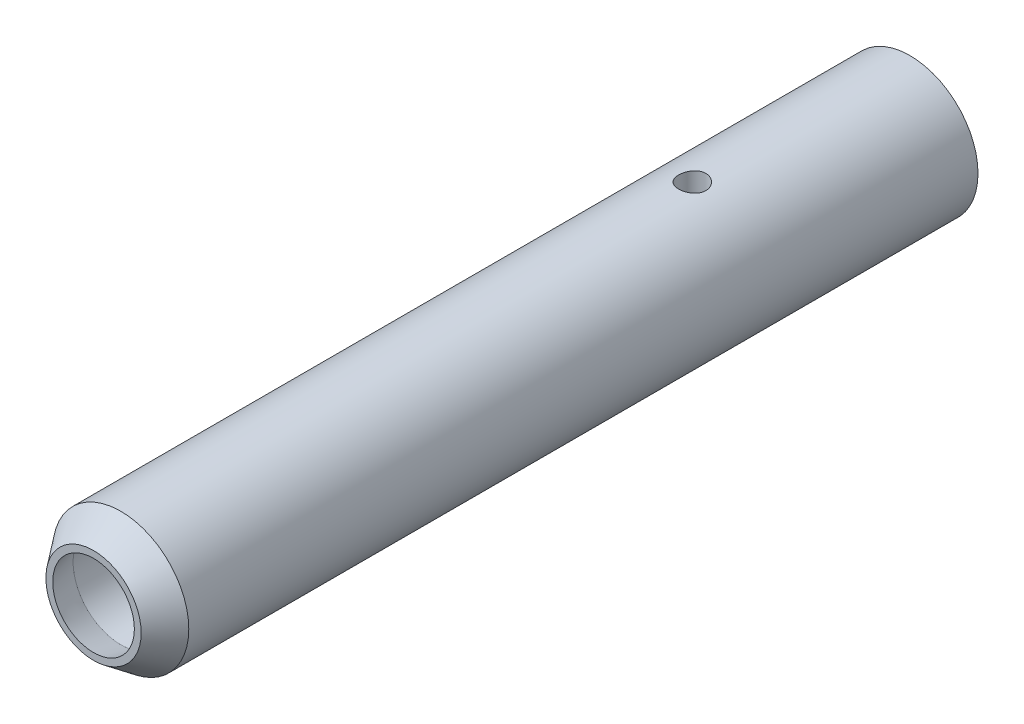
ISO-10303-21;
HEADER;
FILE_DESCRIPTION(('STEP AP214'),'2;1');
FILE_NAME('part.step','',(''),(''),'','','');
FILE_SCHEMA(('AUTOMOTIVE_DESIGN { 1 0 10303 214 1 1 1 1 }'));
ENDSEC;
DATA;
#1=APPLICATION_CONTEXT('core data for automotive mechanical design processes');
#2=APPLICATION_PROTOCOL_DEFINITION('international standard','automotive_design',2000,#1);
#3=PRODUCT_CONTEXT('',#1,'mechanical');
#4=PRODUCT('Part','Part','',(#3));
#5=PRODUCT_RELATED_PRODUCT_CATEGORY('part','',(#4));
#6=PRODUCT_DEFINITION_FORMATION('','',#4);
#7=PRODUCT_DEFINITION_CONTEXT('part definition',#1,'design');
#8=PRODUCT_DEFINITION('design','',#6,#7);
#9=PRODUCT_DEFINITION_SHAPE('','',#8);
#10=(LENGTH_UNIT() NAMED_UNIT(*) SI_UNIT(.MILLI.,.METRE.));
#11=(NAMED_UNIT(*) PLANE_ANGLE_UNIT() SI_UNIT($,.RADIAN.));
#12=(NAMED_UNIT(*) SI_UNIT($,.STERADIAN.) SOLID_ANGLE_UNIT());
#13=UNCERTAINTY_MEASURE_WITH_UNIT(LENGTH_MEASURE(1.E-05),#10,'distance_accuracy_value','');
#14=(GEOMETRIC_REPRESENTATION_CONTEXT(3) GLOBAL_UNCERTAINTY_ASSIGNED_CONTEXT((#13)) GLOBAL_UNIT_ASSIGNED_CONTEXT((#10,
#11,#12)) REPRESENTATION_CONTEXT('',''));
#15=CARTESIAN_POINT('',(0.,0.,0.));
#16=DIRECTION('',(0.,0.,1.));
#17=DIRECTION('',(1.,0.,0.));
#18=AXIS2_PLACEMENT_3D('',#15,#16,#17);
#19=CARTESIAN_POINT('',(0.,0.,50.8));
#20=DIRECTION('',(0.,0.,1.));
#21=DIRECTION('',(1.,0.,0.));
#22=AXIS2_PLACEMENT_3D('',#19,#20,#21);
#23=PLANE('',#22);
#24=CARTESIAN_POINT('',(0.,0.,50.8));
#25=DIRECTION('',(0.,0.,1.));
#26=DIRECTION('',(1.,0.,0.));
#27=AXIS2_PLACEMENT_3D('',#24,#25,#26);
#28=CIRCLE('',#27,3.81);
#29=CARTESIAN_POINT('',(3.81,0.,50.8));
#30=VERTEX_POINT('',#29);
#31=EDGE_CURVE('E72',#30,#30,#28,.T.);
#32=ORIENTED_EDGE('',*,*,#31,.F.);
#33=EDGE_LOOP('',(#32));
#34=FACE_BOUND('',#33,.T.);
#35=CARTESIAN_POINT('',(0.,0.,50.8));
#36=DIRECTION('',(0.,0.,1.));
#37=DIRECTION('',(1.,0.,0.));
#38=AXIS2_PLACEMENT_3D('',#35,#36,#37);
#39=CIRCLE('',#38,4.445);
#40=CARTESIAN_POINT('',(4.445,0.,50.8));
#41=VERTEX_POINT('',#40);
#42=EDGE_CURVE('E12',#41,#41,#39,.T.);
#43=ORIENTED_EDGE('',*,*,#42,.T.);
#44=EDGE_LOOP('',(#43));
#45=FACE_BOUND('',#44,.T.);
#46=ADVANCED_FACE('F59',(#34,#45),#23,.T.);
#47=CARTESIAN_POINT('',(0.,0.,48.26));
#48=DIRECTION('',(0.,0.,1.));
#49=DIRECTION('',(1.,0.,0.));
#50=AXIS2_PLACEMENT_3D('',#47,#48,#49);
#51=PLANE('',#50);
#52=CARTESIAN_POINT('',(0.,0.,48.26));
#53=DIRECTION('',(0.,0.,1.));
#54=DIRECTION('',(1.,0.,0.));
#55=AXIS2_PLACEMENT_3D('',#52,#53,#54);
#56=CIRCLE('',#55,4.445);
#57=CARTESIAN_POINT('',(4.445,0.,48.26));
#58=VERTEX_POINT('',#57);
#59=EDGE_CURVE('E128',#58,#58,#56,.T.);
#60=ORIENTED_EDGE('',*,*,#59,.T.);
#61=EDGE_LOOP('',(#60));
#62=FACE_BOUND('',#61,.T.);
#63=CARTESIAN_POINT('',(0.,0.,48.26));
#64=DIRECTION('',(0.,0.,1.));
#65=DIRECTION('',(1.,0.,0.));
#66=AXIS2_PLACEMENT_3D('',#63,#64,#65);
#67=CIRCLE('',#66,6.35);
#68=CARTESIAN_POINT('',(6.35,0.,48.26));
#69=VERTEX_POINT('',#68);
#70=EDGE_CURVE('E67',#69,#69,#67,.T.);
#71=ORIENTED_EDGE('',*,*,#70,.F.);
#72=EDGE_LOOP('',(#71));
#73=FACE_BOUND('',#72,.T.);
#74=ADVANCED_FACE('F91',(#62,#73),#51,.F.);
#75=CARTESIAN_POINT('',(0.,0.,50.8));
#76=DIRECTION('',(0.,0.,-1.));
#77=DIRECTION('',(-1.,0.,0.));
#78=AXIS2_PLACEMENT_3D('',#75,#76,#77);
#79=CONICAL_SURFACE('',#78,4.445,0.643501108793284);
#80=ORIENTED_EDGE('',*,*,#70,.T.);
#81=EDGE_LOOP('',(#80));
#82=FACE_BOUND('',#81,.T.);
#83=ORIENTED_EDGE('',*,*,#42,.F.);
#84=EDGE_LOOP('',(#83));
#85=FACE_BOUND('',#84,.T.);
#86=ADVANCED_FACE('F100',(#82,#85),#79,.T.);
#87=CARTESIAN_POINT('',(0.,0.,50.8));
#88=DIRECTION('',(0.,0.,-1.));
#89=DIRECTION('',(-1.,0.,0.));
#90=AXIS2_PLACEMENT_3D('',#87,#88,#89);
#91=CONICAL_SURFACE('',#90,3.81,0.244978663126864);
#92=ORIENTED_EDGE('',*,*,#59,.F.);
#93=EDGE_LOOP('',(#92));
#94=FACE_BOUND('',#93,.T.);
#95=ORIENTED_EDGE('',*,*,#31,.T.);
#96=EDGE_LOOP('',(#95));
#97=FACE_BOUND('',#96,.T.);
#98=ADVANCED_FACE('F102',(#94,#97),#91,.F.);
#99=CLOSED_SHELL('',(#46,#74,#86,#98));
#100=MANIFOLD_SOLID_BREP('B2',#99);
#101=CARTESIAN_POINT('',(0.,0.,-25.4));
#102=DIRECTION('',(0.,0.,1.));
#103=DIRECTION('',(1.,0.,0.));
#104=AXIS2_PLACEMENT_3D('',#101,#102,#103);
#105=PLANE('',#104);
#106=CARTESIAN_POINT('',(0.,0.,-25.4));
#107=DIRECTION('',(0.,0.,1.));
#108=DIRECTION('',(1.,0.,0.));
#109=AXIS2_PLACEMENT_3D('',#106,#107,#108);
#110=CIRCLE('',#109,6.35);
#111=CARTESIAN_POINT('',(6.35,0.,-25.4));
#112=VERTEX_POINT('',#111);
#113=EDGE_CURVE('E173',#112,#112,#110,.T.);
#114=ORIENTED_EDGE('',*,*,#113,.F.);
#115=EDGE_LOOP('',(#114));
#116=FACE_BOUND('',#115,.T.);
#117=CARTESIAN_POINT('',(0.,0.,-25.4));
#118=DIRECTION('',(0.,0.,1.));
#119=DIRECTION('',(1.,0.,0.));
#120=AXIS2_PLACEMENT_3D('',#117,#118,#119);
#121=CIRCLE('',#120,3.175);
#122=CARTESIAN_POINT('',(3.175,0.,-25.4));
#123=VERTEX_POINT('',#122);
#124=EDGE_CURVE('E235',#123,#123,#121,.T.);
#125=ORIENTED_EDGE('',*,*,#124,.T.);
#126=EDGE_LOOP('',(#125));
#127=FACE_BOUND('',#126,.T.);
#128=ADVANCED_FACE('F165',(#116,#127),#105,.F.);
#129=CARTESIAN_POINT('',(0.,0.,25.4));
#130=DIRECTION('',(0.,0.,-1.));
#131=DIRECTION('',(-1.,0.,0.));
#132=AXIS2_PLACEMENT_3D('',#129,#130,#131);
#133=CYLINDRICAL_SURFACE('',#132,6.35);
#134=CARTESIAN_POINT('',(0.,6.35,-3.81000000000005));
#135=CARTESIAN_POINT('',(0.0705826716266442,6.34999869927706,-3.81000259651295));
#136=CARTESIAN_POINT('',(0.141198168455933,6.34881109176353,-3.81590403056896));
#137=CARTESIAN_POINT('',(0.280433154765054,6.34418804341504,-3.83933509514641));
#138=CARTESIAN_POINT('',(0.349051013277522,6.34075081682436,-3.85687396365797));
#139=CARTESIAN_POINT('',(0.482257487684407,6.33201234583424,-3.90301641749845));
#140=CARTESIAN_POINT('',(0.54684989427508,6.32671288727432,-3.9316094047928));
#141=CARTESIAN_POINT('',(0.670316145857566,6.31482605504849,-3.9990169543394));
#142=CARTESIAN_POINT('',(0.729190331146281,6.30823875809348,-4.0378309078212));
#143=CARTESIAN_POINT('',(0.840350716189878,6.29440149969062,-4.12513588775017));
#144=CARTESIAN_POINT('',(0.892548317971325,6.28714446790521,-4.17373861134688));
#145=CARTESIAN_POINT('',(0.988106680892195,6.27283709174787,-4.27900136881751));
#146=CARTESIAN_POINT('',(1.03146675185844,6.26578676355538,-4.33566203139565));
#147=CARTESIAN_POINT('',(1.10849632675148,6.25262201102021,-4.45606956512513));
#148=CARTESIAN_POINT('',(1.14207409235965,6.24651668353481,-4.51987620762143));
#149=CARTESIAN_POINT('',(1.19799819655699,6.23603360434191,-4.65236791013523));
#150=CARTESIAN_POINT('',(1.22034564469529,6.23165568197691,-4.72105248744991));
#151=CARTESIAN_POINT('',(1.25288713085373,6.225194626703,-4.86039714216311));
#152=CARTESIAN_POINT('',(1.26323661240765,6.22308217036128,-4.93101953106068));
#153=CARTESIAN_POINT('',(1.27197120221217,6.22130296326996,-5.07302747313276));
#154=CARTESIAN_POINT('',(1.27035753384615,6.22163596244158,-5.14441294752663));
#155=CARTESIAN_POINT('',(1.25533730783931,6.22468339958194,-5.28478342078672));
#156=CARTESIAN_POINT('',(1.24210894610976,6.2273618513063,-5.35378838514674));
#157=CARTESIAN_POINT('',(1.20451611347127,6.23474173623201,-5.48857941736206));
#158=CARTESIAN_POINT('',(1.18015111073787,6.23944326604379,-5.55436533132719));
#159=CARTESIAN_POINT('',(1.12080647526689,6.25037635495518,-5.68136438236362));
#160=CARTESIAN_POINT('',(1.08575621206479,6.25661804063405,-5.7425436070529));
#161=CARTESIAN_POINT('',(1.0060858397073,6.26992165841789,-5.85821897946552));
#162=CARTESIAN_POINT('',(0.961464630733173,6.27698368474725,-5.91271435800102));
#163=CARTESIAN_POINT('',(0.862964916891942,6.29128816976656,-6.01450334112036));
#164=CARTESIAN_POINT('',(0.808934324739805,6.29853158897849,-6.06164976118115));
#165=CARTESIAN_POINT('',(0.693654980558753,6.31226637867299,-6.14623338480261));
#166=CARTESIAN_POINT('',(0.632406135971825,6.31875773950996,-6.1836704638429));
#167=CARTESIAN_POINT('',(0.50426542133623,6.33027296504327,-6.24779993671704));
#168=CARTESIAN_POINT('',(0.437364910873332,6.33529452837305,-6.27447550492861));
#169=CARTESIAN_POINT('',(0.299909200089805,6.3432868941458,-6.31616780202903));
#170=CARTESIAN_POINT('',(0.229354443592011,6.34625794500675,-6.33118594323356));
#171=CARTESIAN_POINT('',(0.0878578451464814,6.34977993270922,-6.34892869631878));
#172=CARTESIAN_POINT('',(0.0169422169734822,6.35037051808637,-6.35185473281619));
#173=CARTESIAN_POINT('',(-0.124364666424746,6.3491751595123,-6.34587267914348));
#174=CARTESIAN_POINT('',(-0.194755950903617,6.34738934915636,-6.33696525422225));
#175=CARTESIAN_POINT('',(-0.332366188132107,6.34166666650182,-6.30773646559923));
#176=CARTESIAN_POINT('',(-0.399607974391677,6.33774928033342,-6.28751845300771));
#177=CARTESIAN_POINT('',(-0.529747006924577,6.32820111117511,-6.23635534202717));
#178=CARTESIAN_POINT('',(-0.592643927279675,6.32257019982068,-6.20540943996048));
#179=CARTESIAN_POINT('',(-0.713157290581496,6.31012087647284,-6.13323323687288));
#180=CARTESIAN_POINT('',(-0.770699660975278,6.30328877055056,-6.09188166808059));
#181=CARTESIAN_POINT('',(-0.878100884281392,6.28922713233951,-6.0002303271668));
#182=CARTESIAN_POINT('',(-0.927958912342068,6.28199755749853,-5.94992959567222));
#183=CARTESIAN_POINT('',(-1.0193535502832,6.26782215517346,-5.84089084309832));
#184=CARTESIAN_POINT('',(-1.06075188210979,6.26088232496296,-5.78203600483895));
#185=CARTESIAN_POINT('',(-1.13307548346503,6.24819923581167,-5.65808957107707));
#186=CARTESIAN_POINT('',(-1.16400117202209,6.24245592899945,-5.59299822524164));
#187=CARTESIAN_POINT('',(-1.21431283880909,6.23286460542166,-5.45875432739012));
#188=CARTESIAN_POINT('',(-1.23375864473463,6.22900678087677,-5.38962493166295));
#189=CARTESIAN_POINT('',(-1.26073998756654,6.22360244725872,-5.2489945140666));
#190=CARTESIAN_POINT('',(-1.26827707764589,6.22205563677711,-5.17749380271418));
#191=CARTESIAN_POINT('',(-1.27116955680168,6.22146520031851,-5.03553874202877));
#192=CARTESIAN_POINT('',(-1.26674345085004,6.22237667370412,-4.96508894086275));
#193=CARTESIAN_POINT('',(-1.24631742620708,6.2264997832546,-4.82595980462067));
#194=CARTESIAN_POINT('',(-1.23031760048421,6.22971140094305,-4.75728045532765));
#195=CARTESIAN_POINT('',(-1.18729578199367,6.23805285558331,-4.62378080672456));
#196=CARTESIAN_POINT('',(-1.16030058353103,6.24317802693915,-4.55895156216198));
#197=CARTESIAN_POINT('',(-1.09607939864404,6.25477178017196,-4.43470827466731));
#198=CARTESIAN_POINT('',(-1.0588525543441,6.26124047468595,-4.37529468636913));
#199=CARTESIAN_POINT('',(-0.974478511778746,6.27492979864496,-4.26248122336915));
#200=CARTESIAN_POINT('',(-0.927173516788679,6.28216133595318,-4.2092006681102));
#201=CARTESIAN_POINT('',(-0.824311748646689,6.29648323977382,-4.111261518978));
#202=CARTESIAN_POINT('',(-0.768753081684736,6.30357357346244,-4.06660490929711));
#203=CARTESIAN_POINT('',(-0.650262388942073,6.31690167132724,-3.98674000218806));
#204=CARTESIAN_POINT('',(-0.58725928322589,6.32312973648443,-3.95163547583442));
#205=CARTESIAN_POINT('',(-0.456141278394731,6.3339360885795,-3.89256762430238));
#206=CARTESIAN_POINT('',(-0.388031051296171,6.33851586166042,-3.86859425729379));
#207=CARTESIAN_POINT('',(-0.266473290933201,6.34461993196121,-3.83711202598326));
#208=CARTESIAN_POINT('',(-0.213717713297507,6.34662565011234,-3.8269631439912));
#209=CARTESIAN_POINT('',(-0.107314397016785,6.34931615757664,-3.81340625130493));
#210=CARTESIAN_POINT('',(-0.0536666868607463,6.35000098898907,-3.80999802577265));
#211=CARTESIAN_POINT('',(0.,6.35,-3.81000000000005));
#212=B_SPLINE_CURVE_WITH_KNOTS('',3,(#134,#135,#136,#137,#138,#139,#140,#141,#142,#143,#144,
#145,#146,#147,#148,#149,#150,#151,#152,#153,#154,#155,#156,#157,#158,#159,#160,#161,#162,#163,
#164,#165,#166,#167,#168,#169,#170,#171,#172,#173,#174,#175,#176,#177,#178,#179,#180,#181,#182,
#183,#184,#185,#186,#187,#188,#189,#190,#191,#192,#193,#194,#195,#196,#197,#198,#199,#200,#201,
#202,#203,#204,#205,#206,#207,#208,#209,#210,#211),.UNSPECIFIED.,.T.,.F.,(4,2,2,2,2,2,2,2,2,2,2,
2,2,2,2,2,2,2,2,2,2,2,2,2,2,2,2,2,2,2,2,2,2,2,2,2,2,2,4),(0.,0.211551685939798,0.42327150637798,
0.634788843767934,0.846293585833196,1.06036449104248,1.27445210786915,1.49048717657522,
1.70650089693801,1.91968355081556,2.13284440437156,2.34279093297973,2.55274748852237,
2.76412312558562,2.97552306532081,3.19072580664015,3.40593130775572,3.6214719906461,
3.83698655636506,4.04889634308857,4.26079421725492,4.47078676517419,4.68079504804348,
4.89337433862365,5.10597643199331,5.32181598295617,5.53764689678802,5.75234283911558,
5.96701077779627,6.17778447660981,6.38855648235613,6.5988179079145,6.80909696828971,
7.02294856823712,7.23684931256822,7.45298860778059,7.66893253507249,7.82978844618166,
7.99063923041165),.UNSPECIFIED.);
#213=CARTESIAN_POINT('',(0.,6.35,-3.81000000000005));
#214=VERTEX_POINT('',#213);
#215=EDGE_CURVE('E186',#214,#214,#212,.T.);
#216=ORIENTED_EDGE('',*,*,#215,.F.);
#217=EDGE_LOOP('',(#216));
#218=FACE_BOUND('',#217,.T.);
#219=ORIENTED_EDGE('',*,*,#113,.T.);
#220=EDGE_LOOP('',(#219));
#221=FACE_BOUND('',#220,.T.);
#222=CARTESIAN_POINT('',(0.,0.,48.26));
#223=DIRECTION('',(0.,0.,1.));
#224=DIRECTION('',(1.,0.,0.));
#225=AXIS2_PLACEMENT_3D('',#222,#223,#224);
#226=CIRCLE('',#225,6.35);
#227=CARTESIAN_POINT('',(6.35,0.,48.26));
#228=VERTEX_POINT('',#227);
#229=EDGE_CURVE('E243',#228,#228,#226,.T.);
#230=ORIENTED_EDGE('',*,*,#229,.F.);
#231=EDGE_LOOP('',(#230));
#232=FACE_BOUND('',#231,.T.);
#233=ADVANCED_FACE('F167',(#218,#221,#232),#133,.T.);
#234=CARTESIAN_POINT('',(0.,0.,25.4));
#235=DIRECTION('',(0.,0.,-1.));
#236=DIRECTION('',(-1.,0.,0.));
#237=AXIS2_PLACEMENT_3D('',#234,#235,#236);
#238=CYLINDRICAL_SURFACE('',#237,3.175);
#239=CARTESIAN_POINT('',(0.,0.,-10.16));
#240=DIRECTION('',(0.,0.,-1.));
#241=DIRECTION('',(-1.,0.,0.));
#242=AXIS2_PLACEMENT_3D('',#239,#240,#241);
#243=CIRCLE('',#242,3.175);
#244=CARTESIAN_POINT('',(-3.175,0.,-10.16));
#245=VERTEX_POINT('',#244);
#246=EDGE_CURVE('E57',#245,#245,#243,.T.);
#247=ORIENTED_EDGE('',*,*,#246,.F.);
#248=EDGE_LOOP('',(#247));
#249=FACE_BOUND('',#248,.T.);
#250=ORIENTED_EDGE('',*,*,#124,.F.);
#251=EDGE_LOOP('',(#250));
#252=FACE_BOUND('',#251,.T.);
#253=ADVANCED_FACE('F220',(#249,#252),#238,.F.);
#254=CARTESIAN_POINT('',(0.,0.,-10.16));
#255=DIRECTION('',(0.,0.,-1.));
#256=DIRECTION('',(-1.,0.,0.));
#257=AXIS2_PLACEMENT_3D('',#254,#255,#256);
#258=PLANE('',#257);
#259=ORIENTED_EDGE('',*,*,#246,.T.);
#260=EDGE_LOOP('',(#259));
#261=FACE_BOUND('',#260,.T.);
#262=ADVANCED_FACE('F208',(#261),#258,.T.);
#263=CARTESIAN_POINT('',(0.,0.,48.26));
#264=DIRECTION('',(0.,0.,1.));
#265=DIRECTION('',(1.,0.,0.));
#266=AXIS2_PLACEMENT_3D('',#263,#264,#265);
#267=PLANE('',#266);
#268=ORIENTED_EDGE('',*,*,#229,.T.);
#269=EDGE_LOOP('',(#268));
#270=FACE_BOUND('',#269,.T.);
#271=CARTESIAN_POINT('',(0.,0.,48.26));
#272=DIRECTION('',(0.,0.,1.));
#273=DIRECTION('',(1.,0.,0.));
#274=AXIS2_PLACEMENT_3D('',#271,#272,#273);
#275=CIRCLE('',#274,4.445);
#276=CARTESIAN_POINT('',(4.445,0.,48.26));
#277=VERTEX_POINT('',#276);
#278=EDGE_CURVE('E248',#277,#277,#275,.T.);
#279=ORIENTED_EDGE('',*,*,#278,.F.);
#280=EDGE_LOOP('',(#279));
#281=FACE_BOUND('',#280,.T.);
#282=ADVANCED_FACE('F204',(#270,#281),#267,.T.);
#283=CARTESIAN_POINT('',(0.,0.,-2.54));
#284=DIRECTION('',(0.,0.,-1.));
#285=DIRECTION('',(-1.,0.,0.));
#286=AXIS2_PLACEMENT_3D('',#283,#284,#285);
#287=PLANE('',#286);
#288=CARTESIAN_POINT('',(0.,0.,-2.54));
#289=DIRECTION('',(0.,0.,-1.));
#290=DIRECTION('',(-1.,0.,0.));
#291=AXIS2_PLACEMENT_3D('',#288,#289,#290);
#292=CIRCLE('',#291,1.27);
#293=CARTESIAN_POINT('',(-1.27,0.,-2.54));
#294=VERTEX_POINT('',#293);
#295=EDGE_CURVE('E197',#294,#294,#292,.F.);
#296=ORIENTED_EDGE('',*,*,#295,.F.);
#297=EDGE_LOOP('',(#296));
#298=FACE_BOUND('',#297,.T.);
#299=CARTESIAN_POINT('',(0.,0.,-2.54));
#300=DIRECTION('',(0.,0.,-1.));
#301=DIRECTION('',(-1.,0.,0.));
#302=AXIS2_PLACEMENT_3D('',#299,#300,#301);
#303=CIRCLE('',#302,4.445);
#304=CARTESIAN_POINT('',(-4.445,0.,-2.54));
#305=VERTEX_POINT('',#304);
#306=EDGE_CURVE('E238',#305,#305,#303,.F.);
#307=ORIENTED_EDGE('',*,*,#306,.T.);
#308=EDGE_LOOP('',(#307));
#309=FACE_BOUND('',#308,.T.);
#310=ADVANCED_FACE('F207',(#298,#309),#287,.F.);
#311=CARTESIAN_POINT('',(0.,0.,-15.1123585694968));
#312=DIRECTION('',(0.,0.,1.));
#313=DIRECTION('',(1.,0.,0.));
#314=AXIS2_PLACEMENT_3D('',#311,#312,#313);
#315=CYLINDRICAL_SURFACE('',#314,4.445);
#316=ORIENTED_EDGE('',*,*,#306,.F.);
#317=EDGE_LOOP('',(#316));
#318=FACE_BOUND('',#317,.T.);
#319=ORIENTED_EDGE('',*,*,#278,.T.);
#320=EDGE_LOOP('',(#319));
#321=FACE_BOUND('',#320,.T.);
#322=ADVANCED_FACE('F210',(#318,#321),#315,.F.);
#323=CARTESIAN_POINT('',(0.,0.,-1.54));
#324=DIRECTION('',(0.,0.,-1.));
#325=DIRECTION('',(-1.,0.,0.));
#326=AXIS2_PLACEMENT_3D('',#323,#324,#325);
#327=CYLINDRICAL_SURFACE('',#326,1.27);
#328=ORIENTED_EDGE('',*,*,#295,.T.);
#329=EDGE_LOOP('',(#328));
#330=FACE_BOUND('',#329,.T.);
#331=CARTESIAN_POINT('',(0.,0.,-3.80999999999999));
#332=DIRECTION('',(0.,0.,-1.));
#333=DIRECTION('',(0.,1.,0.));
#334=AXIS2_PLACEMENT_3D('',#331,#332,#333);
#335=CIRCLE('',#334,1.27);
#336=CARTESIAN_POINT('',(0.,1.27,-3.81));
#337=VERTEX_POINT('',#336);
#338=EDGE_CURVE('E178',#337,#337,#335,.T.);
#339=ORIENTED_EDGE('',*,*,#338,.T.);
#340=EDGE_LOOP('',(#339));
#341=FACE_BOUND('',#340,.T.);
#342=ADVANCED_FACE('F213',(#330,#341),#327,.F.);
#343=CARTESIAN_POINT('',(0.,1.27,-3.81));
#344=DIRECTION('',(1.,0.,0.));
#345=DIRECTION('',(0.,0.,-1.));
#346=AXIS2_PLACEMENT_3D('',#343,#344,#345);
#347=TOROIDAL_SURFACE('',#346,1.27,1.27);
#348=CARTESIAN_POINT('',(0.,1.26999999999998,-5.08000000000005));
#349=DIRECTION('',(0.,1.,0.));
#350=DIRECTION('',(0.,0.,1.));
#351=AXIS2_PLACEMENT_3D('',#348,#349,#350);
#352=CIRCLE('',#351,1.27);
#353=EDGE_CURVE('E181',#337,#337,#352,.T.);
#354=ORIENTED_EDGE('',*,*,#353,.T.);
#355=ORIENTED_EDGE('',*,*,#338,.F.);
#356=EDGE_LOOP('',(#354,#355));
#357=FACE_BOUND('',#356,.T.);
#358=ADVANCED_FACE('F179',(#357),#347,.F.);
#359=CARTESIAN_POINT('',(0.,1.26999999999997,-5.08000000000005));
#360=DIRECTION('',(0.,1.,0.));
#361=DIRECTION('',(0.,0.,1.));
#362=AXIS2_PLACEMENT_3D('',#359,#360,#361);
#363=CYLINDRICAL_SURFACE('',#362,1.27);
#364=ORIENTED_EDGE('',*,*,#215,.T.);
#365=EDGE_LOOP('',(#364));
#366=FACE_BOUND('',#365,.T.);
#367=ORIENTED_EDGE('',*,*,#353,.F.);
#368=EDGE_LOOP('',(#367));
#369=FACE_BOUND('',#368,.T.);
#370=ADVANCED_FACE('F199',(#366,#369),#363,.F.);
#371=CLOSED_SHELL('',(#128,#233,#253,#262,#282,#310,#322,#342,#358,#370));
#372=MANIFOLD_SOLID_BREP('B7',#371);
#373=ADVANCED_BREP_SHAPE_REPRESENTATION('',(#18,#100,#372),#14);
#374=SHAPE_DEFINITION_REPRESENTATION(#9,#373);
ENDSEC;
END-ISO-10303-21;
